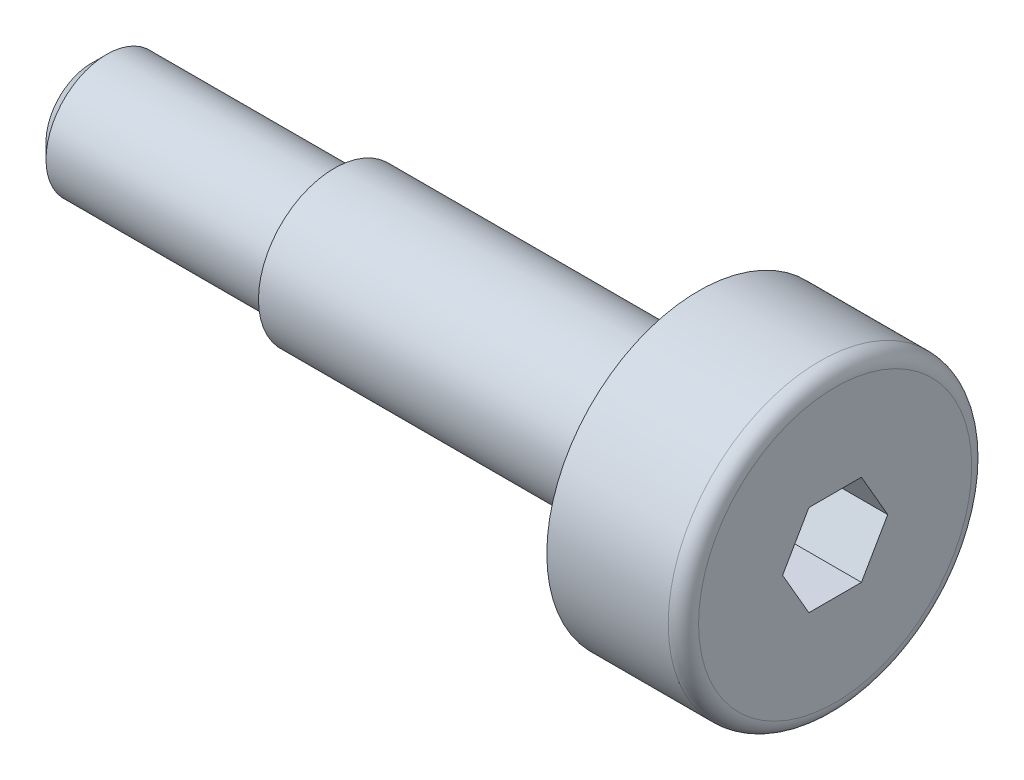
ISO-10303-21;
HEADER;
FILE_DESCRIPTION(('STEP AP214'),'2;1');
FILE_NAME('part.step','',(''),(''),'','','');
FILE_SCHEMA(('AUTOMOTIVE_DESIGN { 1 0 10303 214 1 1 1 1 }'));
ENDSEC;
DATA;
#1=APPLICATION_CONTEXT('core data for automotive mechanical design processes');
#2=APPLICATION_PROTOCOL_DEFINITION('international standard','automotive_design',2000,#1);
#3=PRODUCT_CONTEXT('',#1,'mechanical');
#4=PRODUCT('Part','Part','',(#3));
#5=PRODUCT_RELATED_PRODUCT_CATEGORY('part','',(#4));
#6=PRODUCT_DEFINITION_FORMATION('','',#4);
#7=PRODUCT_DEFINITION_CONTEXT('part definition',#1,'design');
#8=PRODUCT_DEFINITION('design','',#6,#7);
#9=PRODUCT_DEFINITION_SHAPE('','',#8);
#10=(LENGTH_UNIT() NAMED_UNIT(*) SI_UNIT(.MILLI.,.METRE.));
#11=(NAMED_UNIT(*) PLANE_ANGLE_UNIT() SI_UNIT($,.RADIAN.));
#12=(NAMED_UNIT(*) SI_UNIT($,.STERADIAN.) SOLID_ANGLE_UNIT());
#13=UNCERTAINTY_MEASURE_WITH_UNIT(LENGTH_MEASURE(1.E-05),#10,'distance_accuracy_value','');
#14=(GEOMETRIC_REPRESENTATION_CONTEXT(3) GLOBAL_UNCERTAINTY_ASSIGNED_CONTEXT((#13)) GLOBAL_UNIT_ASSIGNED_CONTEXT((#10,
#11,#12)) REPRESENTATION_CONTEXT('',''));
#15=CARTESIAN_POINT('',(0.,0.,0.));
#16=DIRECTION('',(0.,0.,1.));
#17=DIRECTION('',(1.,0.,0.));
#18=AXIS2_PLACEMENT_3D('',#15,#16,#17);
#19=CARTESIAN_POINT('',(0.,0.,0.));
#20=DIRECTION('',(-1.,0.,0.));
#21=DIRECTION('',(0.,0.,1.));
#22=AXIS2_PLACEMENT_3D('',#19,#20,#21);
#23=PLANE('',#22);
#24=DIRECTION('',(0.,0.866025403784439,0.5));
#25=VECTOR('',#24,1.);
#26=CARTESIAN_POINT('',(0.,0.,-1.73205080756888));
#27=LINE('',#26,#25);
#28=CARTESIAN_POINT('',(0.,0.,-1.73205080756888));
#29=VERTEX_POINT('',#28);
#30=CARTESIAN_POINT('',(0.,1.5,-0.866025403784438));
#31=VERTEX_POINT('',#30);
#32=EDGE_CURVE('E137',#29,#31,#27,.T.);
#33=ORIENTED_EDGE('',*,*,#32,.F.);
#34=DIRECTION('',(0.,0.866025403784439,-0.5));
#35=VECTOR('',#34,1.);
#36=CARTESIAN_POINT('',(0.,-1.5,-0.866025403784439));
#37=LINE('',#36,#35);
#38=CARTESIAN_POINT('',(0.,-1.5,-0.866025403784439));
#39=VERTEX_POINT('',#38);
#40=EDGE_CURVE('E57',#39,#29,#37,.T.);
#41=ORIENTED_EDGE('',*,*,#40,.F.);
#42=DIRECTION('',(0.,0.,-1.));
#43=VECTOR('',#42,1.);
#44=CARTESIAN_POINT('',(0.,-1.5,0.866025403784438));
#45=LINE('',#44,#43);
#46=CARTESIAN_POINT('',(0.,-1.5,0.866025403784438));
#47=VERTEX_POINT('',#46);
#48=EDGE_CURVE('E150',#47,#39,#45,.T.);
#49=ORIENTED_EDGE('',*,*,#48,.F.);
#50=DIRECTION('',(0.,-0.866025403784439,-0.5));
#51=VECTOR('',#50,1.);
#52=CARTESIAN_POINT('',(0.,0.,1.73205080756888));
#53=LINE('',#52,#51);
#54=CARTESIAN_POINT('',(0.,0.,1.73205080756888));
#55=VERTEX_POINT('',#54);
#56=EDGE_CURVE('E147',#55,#47,#53,.T.);
#57=ORIENTED_EDGE('',*,*,#56,.F.);
#58=DIRECTION('',(0.,-0.866025403784439,0.5));
#59=VECTOR('',#58,1.);
#60=CARTESIAN_POINT('',(0.,1.5,0.866025403784439));
#61=LINE('',#60,#59);
#62=CARTESIAN_POINT('',(0.,1.5,0.866025403784439));
#63=VERTEX_POINT('',#62);
#64=EDGE_CURVE('E105',#63,#55,#61,.T.);
#65=ORIENTED_EDGE('',*,*,#64,.F.);
#66=DIRECTION('',(0.,0.,1.));
#67=VECTOR('',#66,1.);
#68=CARTESIAN_POINT('',(0.,1.5,-0.866025403784438));
#69=LINE('',#68,#67);
#70=EDGE_CURVE('E141',#31,#63,#69,.T.);
#71=ORIENTED_EDGE('',*,*,#70,.F.);
#72=EDGE_LOOP('',(#33,#41,#49,#57,#65,#71));
#73=FACE_BOUND('',#72,.T.);
#74=CARTESIAN_POINT('',(0.,0.,0.));
#75=DIRECTION('',(-1.,0.,0.));
#76=DIRECTION('',(0.,0.,1.));
#77=AXIS2_PLACEMENT_3D('',#74,#75,#76);
#78=CIRCLE('',#77,4.5);
#79=CARTESIAN_POINT('',(0.,0.,4.5));
#80=VERTEX_POINT('',#79);
#81=EDGE_CURVE('E185',#80,#80,#78,.T.);
#82=ORIENTED_EDGE('',*,*,#81,.F.);
#83=EDGE_LOOP('',(#82));
#84=FACE_BOUND('',#83,.T.);
#85=ADVANCED_FACE('F41',(#73,#84),#23,.F.);
#86=CARTESIAN_POINT('',(-0.5,0.,0.));
#87=DIRECTION('',(-1.,0.,0.));
#88=DIRECTION('',(0.,0.,1.));
#89=AXIS2_PLACEMENT_3D('',#86,#87,#88);
#90=TOROIDAL_SURFACE('',#89,4.5,0.499999999999999);
#91=CARTESIAN_POINT('',(-0.5,0.,0.));
#92=DIRECTION('',(-1.,0.,0.));
#93=DIRECTION('',(0.,0.,1.));
#94=AXIS2_PLACEMENT_3D('',#91,#92,#93);
#95=CIRCLE('',#94,5.);
#96=CARTESIAN_POINT('',(-0.5,0.,5.));
#97=VERTEX_POINT('',#96);
#98=EDGE_CURVE('E181',#97,#97,#95,.T.);
#99=ORIENTED_EDGE('',*,*,#98,.F.);
#100=EDGE_LOOP('',(#99));
#101=FACE_BOUND('',#100,.T.);
#102=ORIENTED_EDGE('',*,*,#81,.T.);
#103=EDGE_LOOP('',(#102));
#104=FACE_BOUND('',#103,.T.);
#105=ADVANCED_FACE('F207',(#101,#104),#90,.T.);
#106=CARTESIAN_POINT('',(0.,0.,0.));
#107=DIRECTION('',(-1.,0.,0.));
#108=DIRECTION('',(0.,0.,1.));
#109=AXIS2_PLACEMENT_3D('',#106,#107,#108);
#110=CYLINDRICAL_SURFACE('',#109,5.);
#111=CARTESIAN_POINT('',(-4.5,0.,0.));
#112=DIRECTION('',(-1.,0.,0.));
#113=DIRECTION('',(0.,0.,1.));
#114=AXIS2_PLACEMENT_3D('',#111,#112,#113);
#115=CIRCLE('',#114,5.);
#116=CARTESIAN_POINT('',(-4.5,0.,5.));
#117=VERTEX_POINT('',#116);
#118=EDGE_CURVE('E177',#117,#117,#115,.T.);
#119=ORIENTED_EDGE('',*,*,#118,.F.);
#120=EDGE_LOOP('',(#119));
#121=FACE_BOUND('',#120,.T.);
#122=ORIENTED_EDGE('',*,*,#98,.T.);
#123=EDGE_LOOP('',(#122));
#124=FACE_BOUND('',#123,.T.);
#125=ADVANCED_FACE('F212',(#121,#124),#110,.T.);
#126=CARTESIAN_POINT('',(-4.5,5.,0.));
#127=DIRECTION('',(1.,0.,0.));
#128=DIRECTION('',(0.,0.,-1.));
#129=AXIS2_PLACEMENT_3D('',#126,#127,#128);
#130=PLANE('',#129);
#131=CARTESIAN_POINT('',(-4.5,0.,0.));
#132=DIRECTION('',(-1.,0.,0.));
#133=DIRECTION('',(0.,0.,1.));
#134=AXIS2_PLACEMENT_3D('',#131,#132,#133);
#135=CIRCLE('',#134,2.5);
#136=CARTESIAN_POINT('',(-4.5,0.,2.5));
#137=VERTEX_POINT('',#136);
#138=EDGE_CURVE('E173',#137,#137,#135,.T.);
#139=ORIENTED_EDGE('',*,*,#138,.F.);
#140=EDGE_LOOP('',(#139));
#141=FACE_BOUND('',#140,.T.);
#142=ORIENTED_EDGE('',*,*,#118,.T.);
#143=EDGE_LOOP('',(#142));
#144=FACE_BOUND('',#143,.T.);
#145=ADVANCED_FACE('F220',(#141,#144),#130,.F.);
#146=CARTESIAN_POINT('',(0.,0.,0.));
#147=DIRECTION('',(-1.,0.,0.));
#148=DIRECTION('',(0.,0.,1.));
#149=AXIS2_PLACEMENT_3D('',#146,#147,#148);
#150=CYLINDRICAL_SURFACE('',#149,2.5);
#151=CARTESIAN_POINT('',(-16.5,0.,0.));
#152=DIRECTION('',(-1.,0.,0.));
#153=DIRECTION('',(0.,0.,1.));
#154=AXIS2_PLACEMENT_3D('',#151,#152,#153);
#155=CIRCLE('',#154,2.5);
#156=CARTESIAN_POINT('',(-16.5,0.,2.5));
#157=VERTEX_POINT('',#156);
#158=EDGE_CURVE('E169',#157,#157,#155,.T.);
#159=ORIENTED_EDGE('',*,*,#158,.F.);
#160=EDGE_LOOP('',(#159));
#161=FACE_BOUND('',#160,.T.);
#162=ORIENTED_EDGE('',*,*,#138,.T.);
#163=EDGE_LOOP('',(#162));
#164=FACE_BOUND('',#163,.T.);
#165=ADVANCED_FACE('F224',(#161,#164),#150,.T.);
#166=CARTESIAN_POINT('',(-16.5,2.5,0.));
#167=DIRECTION('',(1.,0.,0.));
#168=DIRECTION('',(0.,0.,-1.));
#169=AXIS2_PLACEMENT_3D('',#166,#167,#168);
#170=PLANE('',#169);
#171=CARTESIAN_POINT('',(-16.5,0.,0.));
#172=DIRECTION('',(-1.,0.,0.));
#173=DIRECTION('',(0.,0.,1.));
#174=AXIS2_PLACEMENT_3D('',#171,#172,#173);
#175=CIRCLE('',#174,2.);
#176=CARTESIAN_POINT('',(-16.5,0.,2.));
#177=VERTEX_POINT('',#176);
#178=EDGE_CURVE('E156',#177,#177,#175,.T.);
#179=ORIENTED_EDGE('',*,*,#178,.F.);
#180=EDGE_LOOP('',(#179));
#181=FACE_BOUND('',#180,.T.);
#182=ORIENTED_EDGE('',*,*,#158,.T.);
#183=EDGE_LOOP('',(#182));
#184=FACE_BOUND('',#183,.T.);
#185=ADVANCED_FACE('F228',(#181,#184),#170,.F.);
#186=CARTESIAN_POINT('',(0.,0.,0.));
#187=DIRECTION('',(-1.,0.,0.));
#188=DIRECTION('',(0.,0.,1.));
#189=AXIS2_PLACEMENT_3D('',#186,#187,#188);
#190=CYLINDRICAL_SURFACE('',#189,2.);
#191=CARTESIAN_POINT('',(-24.,0.,0.));
#192=DIRECTION('',(1.,0.,0.));
#193=DIRECTION('',(0.,0.,-1.));
#194=AXIS2_PLACEMENT_3D('',#191,#192,#193);
#195=CIRCLE('',#194,2.);
#196=CARTESIAN_POINT('',(-24.,0.,-2.));
#197=VERTEX_POINT('',#196);
#198=EDGE_CURVE('E11',#197,#197,#195,.T.);
#199=ORIENTED_EDGE('',*,*,#198,.T.);
#200=EDGE_LOOP('',(#199));
#201=FACE_BOUND('',#200,.T.);
#202=ORIENTED_EDGE('',*,*,#178,.T.);
#203=EDGE_LOOP('',(#202));
#204=FACE_BOUND('',#203,.T.);
#205=ADVANCED_FACE('F203',(#201,#204),#190,.T.);
#206=CARTESIAN_POINT('',(-24.5,2.,0.));
#207=DIRECTION('',(1.,0.,0.));
#208=DIRECTION('',(0.,0.,-1.));
#209=AXIS2_PLACEMENT_3D('',#206,#207,#208);
#210=PLANE('',#209);
#211=CARTESIAN_POINT('',(-24.5,0.,0.));
#212=DIRECTION('',(1.,0.,0.));
#213=DIRECTION('',(0.,0.,-1.));
#214=AXIS2_PLACEMENT_3D('',#211,#212,#213);
#215=CIRCLE('',#214,1.5);
#216=CARTESIAN_POINT('',(-24.5,0.,-1.5));
#217=VERTEX_POINT('',#216);
#218=EDGE_CURVE('E50',#217,#217,#215,.F.);
#219=ORIENTED_EDGE('',*,*,#218,.T.);
#220=EDGE_LOOP('',(#219));
#221=FACE_BOUND('',#220,.T.);
#222=ADVANCED_FACE('F192',(#221),#210,.F.);
#223=CARTESIAN_POINT('',(-24.5,0.,0.));
#224=DIRECTION('',(1.,0.,0.));
#225=DIRECTION('',(0.,0.,-1.));
#226=AXIS2_PLACEMENT_3D('',#223,#224,#225);
#227=CONICAL_SURFACE('',#226,1.5,0.78539816339745);
#228=ORIENTED_EDGE('',*,*,#198,.F.);
#229=EDGE_LOOP('',(#228));
#230=FACE_BOUND('',#229,.T.);
#231=ORIENTED_EDGE('',*,*,#218,.F.);
#232=EDGE_LOOP('',(#231));
#233=FACE_BOUND('',#232,.T.);
#234=ADVANCED_FACE('F43',(#230,#233),#227,.T.);
#235=CARTESIAN_POINT('',(-2.4,-1.5,-0.866025403784439));
#236=DIRECTION('',(0.,-0.5,-0.866025403784439));
#237=DIRECTION('',(0.,0.866025403784439,-0.5));
#238=AXIS2_PLACEMENT_3D('',#235,#236,#237);
#239=PLANE('',#238);
#240=ORIENTED_EDGE('',*,*,#40,.T.);
#241=DIRECTION('',(1.,0.,0.));
#242=VECTOR('',#241,1.);
#243=CARTESIAN_POINT('',(-2.4,0.,-1.73205080756888));
#244=LINE('',#243,#242);
#245=CARTESIAN_POINT('',(-2.4,0.,-1.73205080756888));
#246=VERTEX_POINT('',#245);
#247=EDGE_CURVE('E87',#246,#29,#244,.T.);
#248=ORIENTED_EDGE('',*,*,#247,.F.);
#249=DIRECTION('',(0.,0.866025403784439,-0.5));
#250=VECTOR('',#249,1.);
#251=CARTESIAN_POINT('',(-2.4,-1.5,-0.866025403784439));
#252=LINE('',#251,#250);
#253=CARTESIAN_POINT('',(-2.4,-1.5,-0.866025403784439));
#254=VERTEX_POINT('',#253);
#255=EDGE_CURVE('E153',#254,#246,#252,.T.);
#256=ORIENTED_EDGE('',*,*,#255,.F.);
#257=DIRECTION('',(1.,0.,0.));
#258=VECTOR('',#257,1.);
#259=CARTESIAN_POINT('',(-2.4,-1.5,-0.866025403784439));
#260=LINE('',#259,#258);
#261=EDGE_CURVE('E65',#254,#39,#260,.T.);
#262=ORIENTED_EDGE('',*,*,#261,.T.);
#263=EDGE_LOOP('',(#240,#248,#256,#262));
#264=FACE_BOUND('',#263,.T.);
#265=ADVANCED_FACE('F195',(#264),#239,.F.);
#266=CARTESIAN_POINT('',(-2.4,-1.5,0.866025403784438));
#267=DIRECTION('',(0.,-1.,0.));
#268=DIRECTION('',(0.,0.,-1.));
#269=AXIS2_PLACEMENT_3D('',#266,#267,#268);
#270=PLANE('',#269);
#271=ORIENTED_EDGE('',*,*,#48,.T.);
#272=ORIENTED_EDGE('',*,*,#261,.F.);
#273=DIRECTION('',(0.,0.,-1.));
#274=VECTOR('',#273,1.);
#275=CARTESIAN_POINT('',(-2.4,-1.5,0.866025403784438));
#276=LINE('',#275,#274);
#277=CARTESIAN_POINT('',(-2.4,-1.5,0.866025403784438));
#278=VERTEX_POINT('',#277);
#279=EDGE_CURVE('E119',#278,#254,#276,.T.);
#280=ORIENTED_EDGE('',*,*,#279,.F.);
#281=DIRECTION('',(1.,0.,0.));
#282=VECTOR('',#281,1.);
#283=CARTESIAN_POINT('',(-2.4,-1.5,0.866025403784438));
#284=LINE('',#283,#282);
#285=EDGE_CURVE('E110',#278,#47,#284,.T.);
#286=ORIENTED_EDGE('',*,*,#285,.T.);
#287=EDGE_LOOP('',(#271,#272,#280,#286));
#288=FACE_BOUND('',#287,.T.);
#289=ADVANCED_FACE('F201',(#288),#270,.F.);
#290=CARTESIAN_POINT('',(-2.4,0.,1.73205080756888));
#291=DIRECTION('',(0.,-0.5,0.866025403784439));
#292=DIRECTION('',(0.,-0.866025403784439,-0.5));
#293=AXIS2_PLACEMENT_3D('',#290,#291,#292);
#294=PLANE('',#293);
#295=ORIENTED_EDGE('',*,*,#56,.T.);
#296=ORIENTED_EDGE('',*,*,#285,.F.);
#297=DIRECTION('',(0.,-0.866025403784439,-0.5));
#298=VECTOR('',#297,1.);
#299=CARTESIAN_POINT('',(-2.4,0.,1.73205080756888));
#300=LINE('',#299,#298);
#301=CARTESIAN_POINT('',(-2.4,0.,1.73205080756888));
#302=VERTEX_POINT('',#301);
#303=EDGE_CURVE('E114',#302,#278,#300,.T.);
#304=ORIENTED_EDGE('',*,*,#303,.F.);
#305=DIRECTION('',(1.,0.,0.));
#306=VECTOR('',#305,1.);
#307=CARTESIAN_POINT('',(-2.4,0.,1.73205080756888));
#308=LINE('',#307,#306);
#309=EDGE_CURVE('E98',#302,#55,#308,.T.);
#310=ORIENTED_EDGE('',*,*,#309,.T.);
#311=EDGE_LOOP('',(#295,#296,#304,#310));
#312=FACE_BOUND('',#311,.T.);
#313=ADVANCED_FACE('F115',(#312),#294,.F.);
#314=CARTESIAN_POINT('',(-2.4,1.5,0.866025403784439));
#315=DIRECTION('',(0.,0.5,0.866025403784439));
#316=DIRECTION('',(0.,-0.866025403784439,0.5));
#317=AXIS2_PLACEMENT_3D('',#314,#315,#316);
#318=PLANE('',#317);
#319=ORIENTED_EDGE('',*,*,#64,.T.);
#320=ORIENTED_EDGE('',*,*,#309,.F.);
#321=DIRECTION('',(0.,-0.866025403784439,0.5));
#322=VECTOR('',#321,1.);
#323=CARTESIAN_POINT('',(-2.4,1.5,0.866025403784439));
#324=LINE('',#323,#322);
#325=CARTESIAN_POINT('',(-2.4,1.5,0.866025403784439));
#326=VERTEX_POINT('',#325);
#327=EDGE_CURVE('E102',#326,#302,#324,.T.);
#328=ORIENTED_EDGE('',*,*,#327,.F.);
#329=DIRECTION('',(1.,0.,0.));
#330=VECTOR('',#329,1.);
#331=CARTESIAN_POINT('',(-2.4,1.5,0.866025403784439));
#332=LINE('',#331,#330);
#333=EDGE_CURVE('E111',#326,#63,#332,.T.);
#334=ORIENTED_EDGE('',*,*,#333,.T.);
#335=EDGE_LOOP('',(#319,#320,#328,#334));
#336=FACE_BOUND('',#335,.T.);
#337=ADVANCED_FACE('F100',(#336),#318,.F.);
#338=CARTESIAN_POINT('',(-2.4,1.5,-0.866025403784438));
#339=DIRECTION('',(0.,1.,0.));
#340=DIRECTION('',(0.,0.,1.));
#341=AXIS2_PLACEMENT_3D('',#338,#339,#340);
#342=PLANE('',#341);
#343=ORIENTED_EDGE('',*,*,#70,.T.);
#344=ORIENTED_EDGE('',*,*,#333,.F.);
#345=DIRECTION('',(0.,0.,1.));
#346=VECTOR('',#345,1.);
#347=CARTESIAN_POINT('',(-2.4,1.5,-0.866025403784438));
#348=LINE('',#347,#346);
#349=CARTESIAN_POINT('',(-2.4,1.5,-0.866025403784438));
#350=VERTEX_POINT('',#349);
#351=EDGE_CURVE('E125',#350,#326,#348,.T.);
#352=ORIENTED_EDGE('',*,*,#351,.F.);
#353=DIRECTION('',(1.,0.,0.));
#354=VECTOR('',#353,1.);
#355=CARTESIAN_POINT('',(-2.4,1.5,-0.866025403784438));
#356=LINE('',#355,#354);
#357=EDGE_CURVE('E161',#350,#31,#356,.T.);
#358=ORIENTED_EDGE('',*,*,#357,.T.);
#359=EDGE_LOOP('',(#343,#344,#352,#358));
#360=FACE_BOUND('',#359,.T.);
#361=ADVANCED_FACE('F239',(#360),#342,.F.);
#362=CARTESIAN_POINT('',(-2.4,0.,-1.73205080756888));
#363=DIRECTION('',(0.,0.5,-0.866025403784438));
#364=DIRECTION('',(0.,0.866025403784439,0.5));
#365=AXIS2_PLACEMENT_3D('',#362,#363,#364);
#366=PLANE('',#365);
#367=ORIENTED_EDGE('',*,*,#32,.T.);
#368=ORIENTED_EDGE('',*,*,#357,.F.);
#369=DIRECTION('',(0.,0.866025403784439,0.5));
#370=VECTOR('',#369,1.);
#371=CARTESIAN_POINT('',(-2.4,0.,-1.73205080756888));
#372=LINE('',#371,#370);
#373=EDGE_CURVE('E129',#246,#350,#372,.T.);
#374=ORIENTED_EDGE('',*,*,#373,.F.);
#375=ORIENTED_EDGE('',*,*,#247,.T.);
#376=EDGE_LOOP('',(#367,#368,#374,#375));
#377=FACE_BOUND('',#376,.T.);
#378=ADVANCED_FACE('F236',(#377),#366,.F.);
#379=CARTESIAN_POINT('',(-2.4,0.,0.));
#380=DIRECTION('',(1.,0.,0.));
#381=DIRECTION('',(0.,0.,-1.));
#382=AXIS2_PLACEMENT_3D('',#379,#380,#381);
#383=PLANE('',#382);
#384=ORIENTED_EDGE('',*,*,#255,.T.);
#385=ORIENTED_EDGE('',*,*,#373,.T.);
#386=ORIENTED_EDGE('',*,*,#351,.T.);
#387=ORIENTED_EDGE('',*,*,#327,.T.);
#388=ORIENTED_EDGE('',*,*,#303,.T.);
#389=ORIENTED_EDGE('',*,*,#279,.T.);
#390=EDGE_LOOP('',(#384,#385,#386,#387,#388,#389));
#391=FACE_BOUND('',#390,.T.);
#392=ADVANCED_FACE('F122',(#391),#383,.T.);
#393=CLOSED_SHELL('',(#85,#105,#125,#145,#165,#185,#205,#222,#234,#265,#289,#313,#337,#361,#378,#392));
#394=MANIFOLD_SOLID_BREP('B2',#393);
#395=ADVANCED_BREP_SHAPE_REPRESENTATION('',(#18,#394),#14);
#396=SHAPE_DEFINITION_REPRESENTATION(#9,#395);
ENDSEC;
END-ISO-10303-21;
